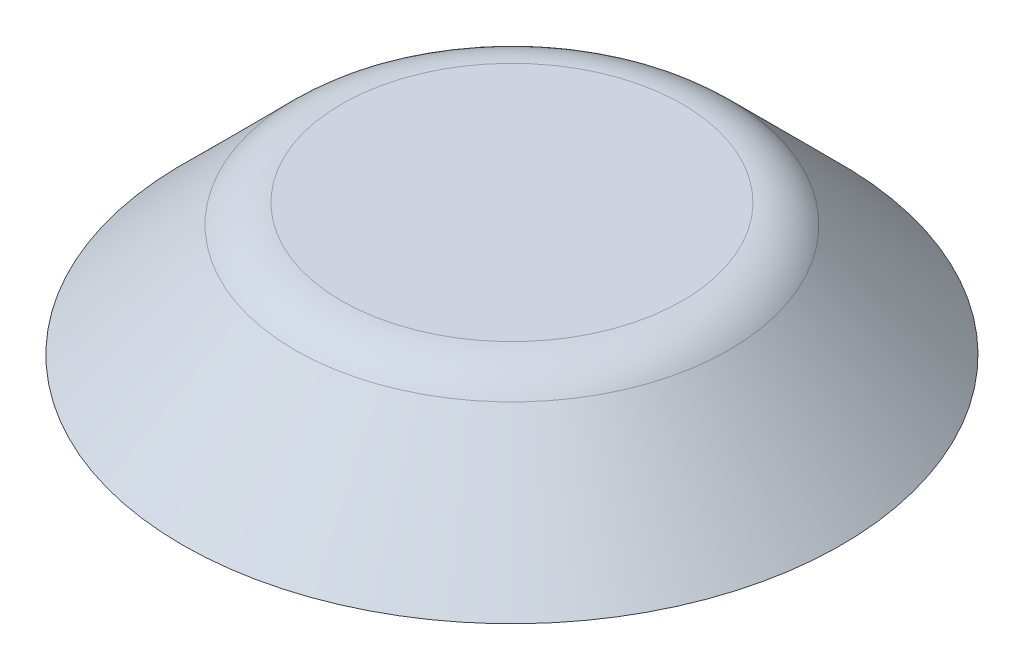
ISO-10303-21;
HEADER;
FILE_DESCRIPTION(('STEP AP214'),'2;1');
FILE_NAME('part.step','',(''),(''),'','','');
FILE_SCHEMA(('AUTOMOTIVE_DESIGN { 1 0 10303 214 1 1 1 1 }'));
ENDSEC;
DATA;
#1=APPLICATION_CONTEXT('core data for automotive mechanical design processes');
#2=APPLICATION_PROTOCOL_DEFINITION('international standard','automotive_design',2000,#1);
#3=PRODUCT_CONTEXT('',#1,'mechanical');
#4=PRODUCT('Part','Part','',(#3));
#5=PRODUCT_RELATED_PRODUCT_CATEGORY('part','',(#4));
#6=PRODUCT_DEFINITION_FORMATION('','',#4);
#7=PRODUCT_DEFINITION_CONTEXT('part definition',#1,'design');
#8=PRODUCT_DEFINITION('design','',#6,#7);
#9=PRODUCT_DEFINITION_SHAPE('','',#8);
#10=(LENGTH_UNIT() NAMED_UNIT(*) SI_UNIT(.MILLI.,.METRE.));
#11=(NAMED_UNIT(*) PLANE_ANGLE_UNIT() SI_UNIT($,.RADIAN.));
#12=(NAMED_UNIT(*) SI_UNIT($,.STERADIAN.) SOLID_ANGLE_UNIT());
#13=UNCERTAINTY_MEASURE_WITH_UNIT(LENGTH_MEASURE(1.E-05),#10,'distance_accuracy_value','');
#14=(GEOMETRIC_REPRESENTATION_CONTEXT(3) GLOBAL_UNCERTAINTY_ASSIGNED_CONTEXT((#13)) GLOBAL_UNIT_ASSIGNED_CONTEXT((#10,
#11,#12)) REPRESENTATION_CONTEXT('',''));
#15=CARTESIAN_POINT('',(0.,0.,0.));
#16=DIRECTION('',(0.,0.,1.));
#17=DIRECTION('',(1.,0.,0.));
#18=AXIS2_PLACEMENT_3D('',#15,#16,#17);
#19=CARTESIAN_POINT('',(0.,0.,0.));
#20=DIRECTION('',(0.,-1.,0.));
#21=DIRECTION('',(0.,0.,1.));
#22=AXIS2_PLACEMENT_3D('',#19,#20,#21);
#23=CONICAL_SURFACE('',#22,12.5,0.78539816339745);
#24=CARTESIAN_POINT('',(0.,4.26776695296637,0.));
#25=DIRECTION('',(0.,-1.,0.));
#26=DIRECTION('',(0.,0.,-1.));
#27=AXIS2_PLACEMENT_3D('',#24,#25,#26);
#28=CIRCLE('',#27,8.23223304703362);
#29=CARTESIAN_POINT('',(0.,4.26776695296637,-8.23223304703362));
#30=VERTEX_POINT('',#29);
#31=EDGE_CURVE('E10',#30,#30,#28,.T.);
#32=ORIENTED_EDGE('',*,*,#31,.T.);
#33=EDGE_LOOP('',(#32));
#34=FACE_BOUND('',#33,.T.);
#35=CARTESIAN_POINT('',(0.,0.,0.));
#36=DIRECTION('',(0.,1.,0.));
#37=DIRECTION('',(0.,0.,1.));
#38=AXIS2_PLACEMENT_3D('',#35,#36,#37);
#39=CIRCLE('',#38,12.5);
#40=CARTESIAN_POINT('',(0.,0.,12.5));
#41=VERTEX_POINT('',#40);
#42=EDGE_CURVE('E42',#41,#41,#39,.T.);
#43=ORIENTED_EDGE('',*,*,#42,.T.);
#44=EDGE_LOOP('',(#43));
#45=FACE_BOUND('',#44,.T.);
#46=ADVANCED_FACE('F31',(#34,#45),#23,.T.);
#47=CARTESIAN_POINT('',(0.,5.,0.));
#48=DIRECTION('',(0.,1.,0.));
#49=DIRECTION('',(0.,0.,1.));
#50=AXIS2_PLACEMENT_3D('',#47,#48,#49);
#51=PLANE('',#50);
#52=CARTESIAN_POINT('',(0.,5.,0.));
#53=DIRECTION('',(0.,1.,0.));
#54=DIRECTION('',(0.,0.,1.));
#55=AXIS2_PLACEMENT_3D('',#52,#53,#54);
#56=CIRCLE('',#55,6.46446609406725);
#57=CARTESIAN_POINT('',(0.,5.,6.46446609406725));
#58=VERTEX_POINT('',#57);
#59=EDGE_CURVE('E38',#58,#58,#56,.T.);
#60=ORIENTED_EDGE('',*,*,#59,.T.);
#61=EDGE_LOOP('',(#60));
#62=FACE_BOUND('',#61,.T.);
#63=ADVANCED_FACE('F66',(#62),#51,.T.);
#64=CARTESIAN_POINT('',(0.,0.,0.));
#65=DIRECTION('',(0.,1.,0.));
#66=DIRECTION('',(0.,0.,1.));
#67=AXIS2_PLACEMENT_3D('',#64,#65,#66);
#68=PLANE('',#67);
#69=CARTESIAN_POINT('',(0.,0.,0.));
#70=DIRECTION('',(0.,-1.,0.));
#71=DIRECTION('',(0.,0.,-1.));
#72=AXIS2_PLACEMENT_3D('',#69,#70,#71);
#73=CIRCLE('',#72,5.);
#74=CARTESIAN_POINT('',(0.,0.,-5.));
#75=VERTEX_POINT('',#74);
#76=EDGE_CURVE('E49',#75,#75,#73,.T.);
#77=ORIENTED_EDGE('',*,*,#76,.F.);
#78=EDGE_LOOP('',(#77));
#79=FACE_BOUND('',#78,.T.);
#80=ORIENTED_EDGE('',*,*,#42,.F.);
#81=EDGE_LOOP('',(#80));
#82=FACE_BOUND('',#81,.T.);
#83=ADVANCED_FACE('F63',(#79,#82),#68,.F.);
#84=CARTESIAN_POINT('',(0.,2.5,0.));
#85=DIRECTION('',(0.,1.,0.));
#86=DIRECTION('',(0.,0.,1.));
#87=AXIS2_PLACEMENT_3D('',#84,#85,#86);
#88=TOROIDAL_SURFACE('',#87,6.46446609406725,2.5);
#89=ORIENTED_EDGE('',*,*,#31,.F.);
#90=EDGE_LOOP('',(#89));
#91=FACE_BOUND('',#90,.T.);
#92=ORIENTED_EDGE('',*,*,#59,.F.);
#93=EDGE_LOOP('',(#92));
#94=FACE_BOUND('',#93,.T.);
#95=ADVANCED_FACE('F33',(#91,#94),#88,.T.);
#96=CARTESIAN_POINT('',(0.,3.,0.));
#97=DIRECTION('',(0.,-1.,0.));
#98=DIRECTION('',(0.,0.,-1.));
#99=AXIS2_PLACEMENT_3D('',#96,#97,#98);
#100=CYLINDRICAL_SURFACE('',#99,5.);
#101=CARTESIAN_POINT('',(0.,3.,0.));
#102=DIRECTION('',(0.,-1.,0.));
#103=DIRECTION('',(0.,0.,-1.));
#104=AXIS2_PLACEMENT_3D('',#101,#102,#103);
#105=CIRCLE('',#104,5.);
#106=CARTESIAN_POINT('',(0.,3.,-5.));
#107=VERTEX_POINT('',#106);
#108=EDGE_CURVE('E46',#107,#107,#105,.T.);
#109=ORIENTED_EDGE('',*,*,#108,.F.);
#110=EDGE_LOOP('',(#109));
#111=FACE_BOUND('',#110,.T.);
#112=ORIENTED_EDGE('',*,*,#76,.T.);
#113=EDGE_LOOP('',(#112));
#114=FACE_BOUND('',#113,.T.);
#115=ADVANCED_FACE('F57',(#111,#114),#100,.F.);
#116=CARTESIAN_POINT('',(0.,3.,0.));
#117=DIRECTION('',(0.,-1.,0.));
#118=DIRECTION('',(0.,0.,-1.));
#119=AXIS2_PLACEMENT_3D('',#116,#117,#118);
#120=PLANE('',#119);
#121=ORIENTED_EDGE('',*,*,#108,.T.);
#122=EDGE_LOOP('',(#121));
#123=FACE_BOUND('',#122,.T.);
#124=ADVANCED_FACE('F55',(#123),#120,.T.);
#125=CLOSED_SHELL('',(#46,#63,#83,#95,#115,#124));
#126=MANIFOLD_SOLID_BREP('B2',#125);
#127=ADVANCED_BREP_SHAPE_REPRESENTATION('',(#18,#126),#14);
#128=SHAPE_DEFINITION_REPRESENTATION(#9,#127);
ENDSEC;
END-ISO-10303-21;
